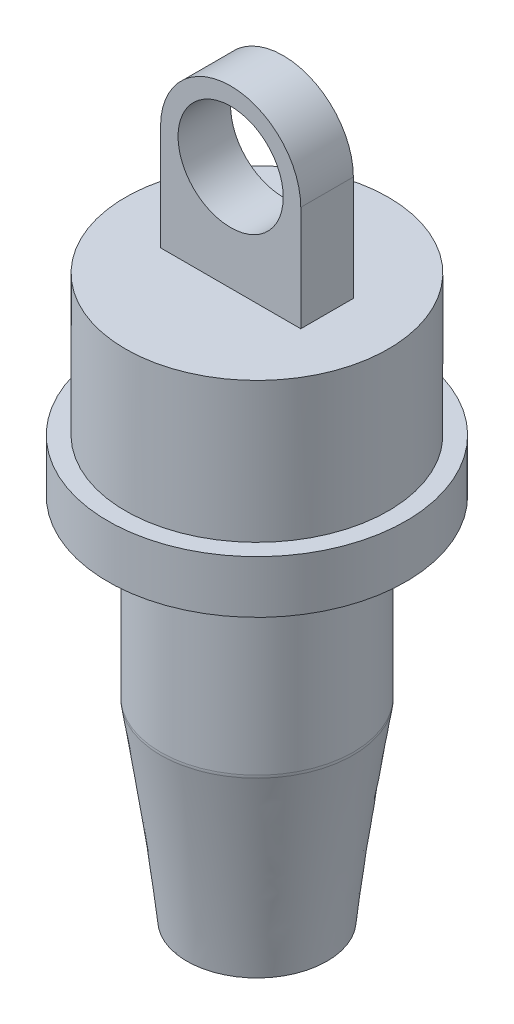
ISO-10303-21;
HEADER;
FILE_DESCRIPTION(('STEP AP214'),'2;1');
FILE_NAME('part.step','',(''),(''),'','','');
FILE_SCHEMA(('AUTOMOTIVE_DESIGN { 1 0 10303 214 1 1 1 1 }'));
ENDSEC;
DATA;
#1=APPLICATION_CONTEXT('core data for automotive mechanical design processes');
#2=APPLICATION_PROTOCOL_DEFINITION('international standard','automotive_design',2000,#1);
#3=PRODUCT_CONTEXT('',#1,'mechanical');
#4=PRODUCT('Part','Part','',(#3));
#5=PRODUCT_RELATED_PRODUCT_CATEGORY('part','',(#4));
#6=PRODUCT_DEFINITION_FORMATION('','',#4);
#7=PRODUCT_DEFINITION_CONTEXT('part definition',#1,'design');
#8=PRODUCT_DEFINITION('design','',#6,#7);
#9=PRODUCT_DEFINITION_SHAPE('','',#8);
#10=(LENGTH_UNIT() NAMED_UNIT(*) SI_UNIT(.MILLI.,.METRE.));
#11=(NAMED_UNIT(*) PLANE_ANGLE_UNIT() SI_UNIT($,.RADIAN.));
#12=(NAMED_UNIT(*) SI_UNIT($,.STERADIAN.) SOLID_ANGLE_UNIT());
#13=UNCERTAINTY_MEASURE_WITH_UNIT(LENGTH_MEASURE(1.E-05),#10,'distance_accuracy_value','');
#14=(GEOMETRIC_REPRESENTATION_CONTEXT(3) GLOBAL_UNCERTAINTY_ASSIGNED_CONTEXT((#13)) GLOBAL_UNIT_ASSIGNED_CONTEXT((#10,
#11,#12)) REPRESENTATION_CONTEXT('',''));
#15=CARTESIAN_POINT('',(0.,0.,0.));
#16=DIRECTION('',(0.,0.,1.));
#17=DIRECTION('',(1.,0.,0.));
#18=AXIS2_PLACEMENT_3D('',#15,#16,#17);
#19=CARTESIAN_POINT('',(0.,-3.,0.));
#20=DIRECTION('',(0.,-1.,0.));
#21=DIRECTION('',(0.,0.,-1.));
#22=AXIS2_PLACEMENT_3D('',#19,#20,#21);
#23=PLANE('',#22);
#24=CARTESIAN_POINT('',(0.,-3.,0.));
#25=DIRECTION('',(0.,-1.,0.));
#26=DIRECTION('',(0.,0.,-1.));
#27=AXIS2_PLACEMENT_3D('',#24,#25,#26);
#28=CIRCLE('',#27,8.5);
#29=CARTESIAN_POINT('',(0.,-3.,-8.5));
#30=VERTEX_POINT('',#29);
#31=EDGE_CURVE('E115',#30,#30,#28,.T.);
#32=ORIENTED_EDGE('',*,*,#31,.T.);
#33=EDGE_LOOP('',(#32));
#34=FACE_BOUND('',#33,.T.);
#35=CARTESIAN_POINT('',(0.,-3.,0.));
#36=DIRECTION('',(0.,-1.,0.));
#37=DIRECTION('',(0.,0.,-1.));
#38=AXIS2_PLACEMENT_3D('',#35,#36,#37);
#39=CIRCLE('',#38,5.5);
#40=CARTESIAN_POINT('',(0.,-3.,-5.5));
#41=VERTEX_POINT('',#40);
#42=EDGE_CURVE('E191',#41,#41,#39,.T.);
#43=ORIENTED_EDGE('',*,*,#42,.F.);
#44=EDGE_LOOP('',(#43));
#45=FACE_BOUND('',#44,.T.);
#46=ADVANCED_FACE('F38',(#34,#45),#23,.T.);
#47=CARTESIAN_POINT('',(4.,18.,1.5));
#48=DIRECTION('',(-1.,0.,0.));
#49=DIRECTION('',(0.,0.,1.));
#50=AXIS2_PLACEMENT_3D('',#47,#48,#49);
#51=PLANE('',#50);
#52=DIRECTION('',(0.,0.,-1.));
#53=VECTOR('',#52,1.);
#54=CARTESIAN_POINT('',(4.,14.,48.9022242487809));
#55=LINE('',#54,#53);
#56=CARTESIAN_POINT('',(4.,14.,1.5));
#57=VERTEX_POINT('',#56);
#58=CARTESIAN_POINT('',(4.,14.,-1.5));
#59=VERTEX_POINT('',#58);
#60=EDGE_CURVE('E91',#57,#59,#55,.T.);
#61=ORIENTED_EDGE('',*,*,#60,.F.);
#62=DIRECTION('',(0.,-1.,0.));
#63=VECTOR('',#62,1.);
#64=CARTESIAN_POINT('',(4.,18.,1.5));
#65=LINE('',#64,#63);
#66=CARTESIAN_POINT('',(4.,8.,1.5));
#67=VERTEX_POINT('',#66);
#68=EDGE_CURVE('E78',#57,#67,#65,.T.);
#69=ORIENTED_EDGE('',*,*,#68,.T.);
#70=DIRECTION('',(0.,0.,-1.));
#71=VECTOR('',#70,1.);
#72=CARTESIAN_POINT('',(4.,8.,1.5));
#73=LINE('',#72,#71);
#74=CARTESIAN_POINT('',(4.,8.,-1.5));
#75=VERTEX_POINT('',#74);
#76=EDGE_CURVE('E98',#67,#75,#73,.T.);
#77=ORIENTED_EDGE('',*,*,#76,.T.);
#78=DIRECTION('',(0.,-1.,0.));
#79=VECTOR('',#78,1.);
#80=CARTESIAN_POINT('',(4.,18.,-1.5));
#81=LINE('',#80,#79);
#82=EDGE_CURVE('E93',#59,#75,#81,.T.);
#83=ORIENTED_EDGE('',*,*,#82,.F.);
#84=EDGE_LOOP('',(#61,#69,#77,#83));
#85=FACE_BOUND('',#84,.T.);
#86=ADVANCED_FACE('F92',(#85),#51,.F.);
#87=CARTESIAN_POINT('',(-4.,18.,-1.5));
#88=DIRECTION('',(0.,0.,1.));
#89=DIRECTION('',(1.,0.,0.));
#90=AXIS2_PLACEMENT_3D('',#87,#88,#89);
#91=PLANE('',#90);
#92=CARTESIAN_POINT('',(0.,14.,-1.5));
#93=DIRECTION('',(0.,0.,1.));
#94=DIRECTION('',(1.,0.,0.));
#95=AXIS2_PLACEMENT_3D('',#92,#93,#94);
#96=CIRCLE('',#95,3.);
#97=CARTESIAN_POINT('',(3.,14.,-1.5));
#98=VERTEX_POINT('',#97);
#99=EDGE_CURVE('E184',#98,#98,#96,.F.);
#100=ORIENTED_EDGE('',*,*,#99,.F.);
#101=EDGE_LOOP('',(#100));
#102=FACE_BOUND('',#101,.T.);
#103=CARTESIAN_POINT('',(0.,14.,-1.5));
#104=DIRECTION('',(0.,0.,1.));
#105=DIRECTION('',(1.,0.,0.));
#106=AXIS2_PLACEMENT_3D('',#103,#104,#105);
#107=CIRCLE('',#106,4.);
#108=CARTESIAN_POINT('',(-4.,14.,-1.5));
#109=VERTEX_POINT('',#108);
#110=EDGE_CURVE('E53',#59,#109,#107,.T.);
#111=ORIENTED_EDGE('',*,*,#110,.F.);
#112=ORIENTED_EDGE('',*,*,#82,.T.);
#113=DIRECTION('',(-1.,0.,0.));
#114=VECTOR('',#113,1.);
#115=CARTESIAN_POINT('',(-4.,8.,-1.5));
#116=LINE('',#115,#114);
#117=CARTESIAN_POINT('',(-4.,8.,-1.5));
#118=VERTEX_POINT('',#117);
#119=EDGE_CURVE('E103',#75,#118,#116,.T.);
#120=ORIENTED_EDGE('',*,*,#119,.T.);
#121=DIRECTION('',(0.,-1.,0.));
#122=VECTOR('',#121,1.);
#123=CARTESIAN_POINT('',(-4.,18.,-1.5));
#124=LINE('',#123,#122);
#125=EDGE_CURVE('E111',#109,#118,#124,.T.);
#126=ORIENTED_EDGE('',*,*,#125,.F.);
#127=EDGE_LOOP('',(#111,#112,#120,#126));
#128=FACE_BOUND('',#127,.T.);
#129=ADVANCED_FACE('F154',(#102,#128),#91,.F.);
#130=CARTESIAN_POINT('',(-4.,18.,1.5));
#131=DIRECTION('',(0.,0.,-1.));
#132=DIRECTION('',(-1.,0.,0.));
#133=AXIS2_PLACEMENT_3D('',#130,#131,#132);
#134=PLANE('',#133);
#135=CARTESIAN_POINT('',(0.,14.,1.5));
#136=DIRECTION('',(0.,0.,1.));
#137=DIRECTION('',(1.,0.,0.));
#138=AXIS2_PLACEMENT_3D('',#135,#136,#137);
#139=CIRCLE('',#138,3.);
#140=CARTESIAN_POINT('',(3.,14.,1.5));
#141=VERTEX_POINT('',#140);
#142=EDGE_CURVE('E186',#141,#141,#139,.T.);
#143=ORIENTED_EDGE('',*,*,#142,.F.);
#144=EDGE_LOOP('',(#143));
#145=FACE_BOUND('',#144,.T.);
#146=CARTESIAN_POINT('',(0.,14.,1.5));
#147=DIRECTION('',(0.,0.,-1.));
#148=DIRECTION('',(-1.,0.,0.));
#149=AXIS2_PLACEMENT_3D('',#146,#147,#148);
#150=CIRCLE('',#149,4.);
#151=CARTESIAN_POINT('',(-4.,14.,1.5));
#152=VERTEX_POINT('',#151);
#153=EDGE_CURVE('E82',#152,#57,#150,.T.);
#154=ORIENTED_EDGE('',*,*,#153,.F.);
#155=DIRECTION('',(0.,-1.,0.));
#156=VECTOR('',#155,1.);
#157=CARTESIAN_POINT('',(-4.,18.,1.5));
#158=LINE('',#157,#156);
#159=CARTESIAN_POINT('',(-4.,8.,1.5));
#160=VERTEX_POINT('',#159);
#161=EDGE_CURVE('E89',#152,#160,#158,.T.);
#162=ORIENTED_EDGE('',*,*,#161,.T.);
#163=DIRECTION('',(1.,0.,0.));
#164=VECTOR('',#163,1.);
#165=CARTESIAN_POINT('',(-4.,8.,1.5));
#166=LINE('',#165,#164);
#167=EDGE_CURVE('E85',#160,#67,#166,.T.);
#168=ORIENTED_EDGE('',*,*,#167,.T.);
#169=ORIENTED_EDGE('',*,*,#68,.F.);
#170=EDGE_LOOP('',(#154,#162,#168,#169));
#171=FACE_BOUND('',#170,.T.);
#172=ADVANCED_FACE('F80',(#145,#171),#134,.F.);
#173=CARTESIAN_POINT('',(0.,8.,0.));
#174=DIRECTION('',(0.,1.,0.));
#175=DIRECTION('',(0.,0.,1.));
#176=AXIS2_PLACEMENT_3D('',#173,#174,#175);
#177=PLANE('',#176);
#178=CARTESIAN_POINT('',(0.,8.,0.));
#179=DIRECTION('',(0.,1.,0.));
#180=DIRECTION('',(0.,0.,1.));
#181=AXIS2_PLACEMENT_3D('',#178,#179,#180);
#182=CIRCLE('',#181,7.5);
#183=CARTESIAN_POINT('',(0.,8.,7.5));
#184=VERTEX_POINT('',#183);
#185=EDGE_CURVE('E123',#184,#184,#182,.T.);
#186=ORIENTED_EDGE('',*,*,#185,.T.);
#187=EDGE_LOOP('',(#186));
#188=FACE_BOUND('',#187,.T.);
#189=ORIENTED_EDGE('',*,*,#119,.F.);
#190=ORIENTED_EDGE('',*,*,#76,.F.);
#191=ORIENTED_EDGE('',*,*,#167,.F.);
#192=DIRECTION('',(0.,0.,1.));
#193=VECTOR('',#192,1.);
#194=CARTESIAN_POINT('',(-4.,8.,1.5));
#195=LINE('',#194,#193);
#196=EDGE_CURVE('E106',#118,#160,#195,.T.);
#197=ORIENTED_EDGE('',*,*,#196,.F.);
#198=EDGE_LOOP('',(#189,#190,#191,#197));
#199=FACE_BOUND('',#198,.T.);
#200=ADVANCED_FACE('F169',(#188,#199),#177,.T.);
#201=CARTESIAN_POINT('',(0.,8.,0.));
#202=DIRECTION('',(0.,-1.,0.));
#203=DIRECTION('',(0.,0.,-1.));
#204=AXIS2_PLACEMENT_3D('',#201,#202,#203);
#205=CYLINDRICAL_SURFACE('',#204,7.5);
#206=ORIENTED_EDGE('',*,*,#185,.F.);
#207=EDGE_LOOP('',(#206));
#208=FACE_BOUND('',#207,.T.);
#209=CARTESIAN_POINT('',(0.,0.,0.));
#210=DIRECTION('',(0.,-1.,0.));
#211=DIRECTION('',(0.,0.,-1.));
#212=AXIS2_PLACEMENT_3D('',#209,#210,#211);
#213=CIRCLE('',#212,7.5);
#214=CARTESIAN_POINT('',(0.,0.,-7.5));
#215=VERTEX_POINT('',#214);
#216=EDGE_CURVE('E118',#215,#215,#213,.T.);
#217=ORIENTED_EDGE('',*,*,#216,.F.);
#218=EDGE_LOOP('',(#217));
#219=FACE_BOUND('',#218,.T.);
#220=ADVANCED_FACE('F163',(#208,#219),#205,.T.);
#221=CARTESIAN_POINT('',(0.,0.,0.));
#222=DIRECTION('',(0.,-1.,0.));
#223=DIRECTION('',(0.,0.,-1.));
#224=AXIS2_PLACEMENT_3D('',#221,#222,#223);
#225=PLANE('',#224);
#226=CARTESIAN_POINT('',(0.,0.,0.));
#227=DIRECTION('',(0.,-1.,0.));
#228=DIRECTION('',(0.,0.,-1.));
#229=AXIS2_PLACEMENT_3D('',#226,#227,#228);
#230=CIRCLE('',#229,8.5);
#231=CARTESIAN_POINT('',(0.,0.,-8.5));
#232=VERTEX_POINT('',#231);
#233=EDGE_CURVE('E114',#232,#232,#230,.T.);
#234=ORIENTED_EDGE('',*,*,#233,.F.);
#235=EDGE_LOOP('',(#234));
#236=FACE_BOUND('',#235,.T.);
#237=ORIENTED_EDGE('',*,*,#216,.T.);
#238=EDGE_LOOP('',(#237));
#239=FACE_BOUND('',#238,.T.);
#240=ADVANCED_FACE('F159',(#236,#239),#225,.F.);
#241=CARTESIAN_POINT('',(0.,-3.,0.));
#242=DIRECTION('',(0.,1.,0.));
#243=DIRECTION('',(0.,0.,1.));
#244=AXIS2_PLACEMENT_3D('',#241,#242,#243);
#245=CYLINDRICAL_SURFACE('',#244,8.5);
#246=ORIENTED_EDGE('',*,*,#31,.F.);
#247=EDGE_LOOP('',(#246));
#248=FACE_BOUND('',#247,.T.);
#249=ORIENTED_EDGE('',*,*,#233,.T.);
#250=EDGE_LOOP('',(#249));
#251=FACE_BOUND('',#250,.T.);
#252=ADVANCED_FACE('F162',(#248,#251),#245,.T.);
#253=CARTESIAN_POINT('',(-4.,18.,1.5));
#254=DIRECTION('',(1.,0.,0.));
#255=DIRECTION('',(0.,0.,-1.));
#256=AXIS2_PLACEMENT_3D('',#253,#254,#255);
#257=PLANE('',#256);
#258=ORIENTED_EDGE('',*,*,#161,.F.);
#259=DIRECTION('',(0.,0.,-1.));
#260=VECTOR('',#259,1.);
#261=CARTESIAN_POINT('',(-4.,13.999999870631,48.9022242487809));
#262=LINE('',#261,#260);
#263=EDGE_CURVE('E94',#152,#109,#262,.T.);
#264=ORIENTED_EDGE('',*,*,#263,.T.);
#265=ORIENTED_EDGE('',*,*,#125,.T.);
#266=ORIENTED_EDGE('',*,*,#196,.T.);
#267=EDGE_LOOP('',(#258,#264,#265,#266));
#268=FACE_BOUND('',#267,.T.);
#269=ADVANCED_FACE('F167',(#268),#257,.F.);
#270=CARTESIAN_POINT('',(0.,14.,48.9022242487809));
#271=DIRECTION('',(0.,0.,-1.));
#272=DIRECTION('',(-1.,0.,0.));
#273=AXIS2_PLACEMENT_3D('',#270,#271,#272);
#274=CYLINDRICAL_SURFACE('',#273,4.);
#275=ORIENTED_EDGE('',*,*,#60,.T.);
#276=ORIENTED_EDGE('',*,*,#110,.T.);
#277=ORIENTED_EDGE('',*,*,#263,.F.);
#278=ORIENTED_EDGE('',*,*,#153,.T.);
#279=EDGE_LOOP('',(#275,#276,#277,#278));
#280=FACE_BOUND('',#279,.T.);
#281=ADVANCED_FACE('F96',(#280),#274,.T.);
#282=CARTESIAN_POINT('',(0.,14.,-9.98528137423857));
#283=DIRECTION('',(0.,0.,1.));
#284=DIRECTION('',(1.,0.,0.));
#285=AXIS2_PLACEMENT_3D('',#282,#283,#284);
#286=CYLINDRICAL_SURFACE('',#285,3.);
#287=ORIENTED_EDGE('',*,*,#99,.T.);
#288=EDGE_LOOP('',(#287));
#289=FACE_BOUND('',#288,.T.);
#290=ORIENTED_EDGE('',*,*,#142,.T.);
#291=EDGE_LOOP('',(#290));
#292=FACE_BOUND('',#291,.T.);
#293=ADVANCED_FACE('F274',(#289,#292),#286,.F.);
#294=CARTESIAN_POINT('',(0.,-13.,0.));
#295=DIRECTION('',(0.,1.,0.));
#296=DIRECTION('',(0.,0.,1.));
#297=AXIS2_PLACEMENT_3D('',#294,#295,#296);
#298=CYLINDRICAL_SURFACE('',#297,5.5);
#299=CARTESIAN_POINT('',(0.,-12.9207997010204,0.));
#300=DIRECTION('',(0.,1.,0.));
#301=DIRECTION('',(0.,0.,1.));
#302=AXIS2_PLACEMENT_3D('',#299,#300,#301);
#303=CIRCLE('',#302,5.5);
#304=CARTESIAN_POINT('',(0.,-12.9207997010204,5.5));
#305=VERTEX_POINT('',#304);
#306=EDGE_CURVE('E12',#305,#305,#303,.T.);
#307=ORIENTED_EDGE('',*,*,#306,.T.);
#308=EDGE_LOOP('',(#307));
#309=FACE_BOUND('',#308,.T.);
#310=ORIENTED_EDGE('',*,*,#42,.T.);
#311=EDGE_LOOP('',(#310));
#312=FACE_BOUND('',#311,.T.);
#313=ADVANCED_FACE('F143',(#309,#312),#298,.T.);
#314=CARTESIAN_POINT('',(0.,-24.,0.));
#315=DIRECTION('',(0.,-1.,0.));
#316=DIRECTION('',(0.,0.,-1.));
#317=AXIS2_PLACEMENT_3D('',#314,#315,#316);
#318=PLANE('',#317);
#319=CARTESIAN_POINT('',(0.,-24.,0.));
#320=DIRECTION('',(0.,-1.,0.));
#321=DIRECTION('',(0.,0.,-1.));
#322=AXIS2_PLACEMENT_3D('',#319,#320,#321);
#323=CIRCLE('',#322,1.75);
#324=CARTESIAN_POINT('',(0.,-24.,-1.75));
#325=VERTEX_POINT('',#324);
#326=EDGE_CURVE('E233',#325,#325,#323,.T.);
#327=ORIENTED_EDGE('',*,*,#326,.F.);
#328=EDGE_LOOP('',(#327));
#329=FACE_BOUND('',#328,.T.);
#330=CARTESIAN_POINT('',(0.,-24.,0.));
#331=DIRECTION('',(0.,-1.,0.));
#332=DIRECTION('',(0.,0.,-1.));
#333=AXIS2_PLACEMENT_3D('',#330,#331,#332);
#334=CIRCLE('',#333,4.);
#335=CARTESIAN_POINT('',(-0.660465844731431,-24.,3.94509630654857));
#336=VERTEX_POINT('',#335);
#337=EDGE_CURVE('E196',#336,#336,#334,.T.);
#338=ORIENTED_EDGE('',*,*,#337,.T.);
#339=EDGE_LOOP('',(#338));
#340=FACE_BOUND('',#339,.T.);
#341=ADVANCED_FACE('F134',(#329,#340),#318,.T.);
#342=CARTESIAN_POINT('',(1.05434897283438,-13.,5.39799483544428));
#343=CARTESIAN_POINT('',(-0.660465844731431,-24.,3.94509630654857));
#344=CARTESIAN_POINT('',(-9.74164069805419,-13.,7.50669278111303));
#345=CARTESIAN_POINT('',(-8.55065845782857,-24.,2.62416461708571));
#346=CARTESIAN_POINT('',(-11.8503386437229,-13.,-3.28929688977553));
#347=CARTESIAN_POINT('',(-7.22972676836571,-24.,-5.26602799601143));
#348=CARTESIAN_POINT('',(-1.05434897283437,-13.,-5.39799483544428));
#349=CARTESIAN_POINT('',(0.660465844731429,-24.,-3.94509630654857));
#350=CARTESIAN_POINT('',(9.74164069805418,-13.,-7.50669278111302));
#351=CARTESIAN_POINT('',(8.55065845782858,-24.,-2.62416461708572));
#352=CARTESIAN_POINT('',(11.8503386437229,-13.,3.28929688977554));
#353=CARTESIAN_POINT('',(7.22972676836572,-24.,5.26602799601143));
#354=CARTESIAN_POINT('',(1.05434897283438,-13.,5.39799483544428));
#355=CARTESIAN_POINT('',(-0.660465844731431,-24.,3.94509630654857));
#356=(BOUNDED_SURFACE() B_SPLINE_SURFACE(3,1,((#342,#343),(#344,#345),(#346,#347),(#348,#349),
(#350,#351),(#352,#353),(#354,#355)),.UNSPECIFIED.,.T.,.F.,.F.) B_SPLINE_SURFACE_WITH_KNOTS((4,
3,4),(2,2),(0.,0.5,1.),(0.,1.),
.UNSPECIFIED.) GEOMETRIC_REPRESENTATION_ITEM() RATIONAL_B_SPLINE_SURFACE(((1.,1.),
(0.333333333333333,0.333333333333334),(0.333333333333333,0.333333333333334),(1.,1.),
(0.333333333333333,0.333333333333333),(0.333333333333333,0.333333333333333),(1.,1.))) REPRESENTATION_ITEM('') SURFACE());
#357=CARTESIAN_POINT('',(0.,-13.0781009925885,0.));
#358=DIRECTION('',(0.,-1.,0.));
#359=DIRECTION('',(0.,0.,-1.));
#360=AXIS2_PLACEMENT_3D('',#357,#358,#359);
#361=CIRCLE('',#360,5.48755065878719);
#362=CARTESIAN_POINT('',(1.0421736328928,-13.0781009925885,5.38767912478636));
#363=VERTEX_POINT('',#362);
#364=EDGE_CURVE('E46',#363,#363,#361,.T.);
#365=CARTESIAN_POINT('',(1.0421736328928,-13.0781009925885,5.38767912478636));
#366=CARTESIAN_POINT('',(1.02443780500088,-13.1918707739157,5.37265222042972));
#367=CARTESIAN_POINT('',(1.00670197710896,-13.3056405552429,5.35762531607307));
#368=CARTESIAN_POINT('',(0.971230321325126,-13.5331801178973,5.32757150735979));
#369=CARTESIAN_POINT('',(0.953494493433207,-13.6469498992245,5.31254460300314));
#370=CARTESIAN_POINT('',(0.918022837649369,-13.8744894618789,5.28249079428986));
#371=CARTESIAN_POINT('',(0.90028700975745,-13.9882592432061,5.26746388993321));
#372=CARTESIAN_POINT('',(0.864815353973612,-14.2157988058605,5.23741008121992));
#373=CARTESIAN_POINT('',(0.847079526081693,-14.3295685871877,5.22238317686328));
#374=CARTESIAN_POINT('',(0.811607870297855,-14.5571081498421,5.19232936814999));
#375=CARTESIAN_POINT('',(0.793872042405936,-14.6708779311693,5.17730246379335));
#376=CARTESIAN_POINT('',(0.758400386622097,-14.8984174938237,5.14724865508006));
#377=CARTESIAN_POINT('',(0.740664558730178,-15.0121872751509,5.13222175072342));
#378=CARTESIAN_POINT('',(0.70519290294634,-15.2397268378053,5.10216794201013));
#379=CARTESIAN_POINT('',(0.687457075054421,-15.3534966191325,5.08714103765349));
#380=CARTESIAN_POINT('',(0.651985419270583,-15.5810361817869,5.0570872289402));
#381=CARTESIAN_POINT('',(0.634249591378664,-15.6948059631142,5.04206032458356));
#382=CARTESIAN_POINT('',(0.598777935594825,-15.9223455257686,5.01200651587027));
#383=CARTESIAN_POINT('',(0.581042107702906,-16.0361153070958,4.99697961151363));
#384=CARTESIAN_POINT('',(0.545570451919068,-16.2636548697502,4.96692580280034));
#385=CARTESIAN_POINT('',(0.527834624027149,-16.3774246510774,4.9518988984437));
#386=CARTESIAN_POINT('',(0.492362968243311,-16.6049642137318,4.92184508973041));
#387=CARTESIAN_POINT('',(0.474627140351392,-16.718733995059,4.90681818537377));
#388=CARTESIAN_POINT('',(0.439155484567554,-16.9462735577134,4.87676437666048));
#389=CARTESIAN_POINT('',(0.421419656675634,-17.0600433390406,4.86173747230383));
#390=CARTESIAN_POINT('',(0.385948000891796,-17.287582901695,4.83168366359055));
#391=CARTESIAN_POINT('',(0.368212172999877,-17.4013526830222,4.8166567592339));
#392=CARTESIAN_POINT('',(0.332740517216039,-17.6288922456766,4.78660295052062));
#393=CARTESIAN_POINT('',(0.31500468932412,-17.7426620270038,4.77157604616397));
#394=CARTESIAN_POINT('',(0.279533033540282,-17.9702015896582,4.74152223745068));
#395=CARTESIAN_POINT('',(0.261797205648363,-18.0839713709854,4.72649533309404));
#396=CARTESIAN_POINT('',(0.226325549864524,-18.3115109336398,4.69644152438075));
#397=CARTESIAN_POINT('',(0.208589721972605,-18.425280714967,4.68141462002411));
#398=CARTESIAN_POINT('',(0.173118066188767,-18.6528202776214,4.65136081131082));
#399=CARTESIAN_POINT('',(0.155382238296848,-18.7665900589486,4.63633390695418));
#400=CARTESIAN_POINT('',(0.11991058251301,-18.9941296216031,4.60628009824089));
#401=CARTESIAN_POINT('',(0.102174754621091,-19.1078994029303,4.59125319388425));
#402=CARTESIAN_POINT('',(0.0667030988372525,-19.3354389655847,4.56119938517096));
#403=CARTESIAN_POINT('',(0.0489672709453333,-19.4492087469119,4.54617248081432));
#404=CARTESIAN_POINT('',(0.013495615161495,-19.6767483095663,4.51611867210103));
#405=CARTESIAN_POINT('',(-0.00424021273042414,-19.7905180908935,4.50109176774439));
#406=CARTESIAN_POINT('',(-0.0397118685142622,-20.0180576535479,4.4710379590311));
#407=CARTESIAN_POINT('',(-0.0574476964061812,-20.1318274348751,4.45601105467446));
#408=CARTESIAN_POINT('',(-0.0929193521900195,-20.3593669975295,4.42595724596117));
#409=CARTESIAN_POINT('',(-0.110655180081939,-20.4731367788567,4.41093034160453));
#410=CARTESIAN_POINT('',(-0.146126835865777,-20.7006763415111,4.38087653289124));
#411=CARTESIAN_POINT('',(-0.163862663757696,-20.8144461228383,4.36584962853459));
#412=CARTESIAN_POINT('',(-0.199334319541534,-21.0419856854927,4.33579581982131));
#413=CARTESIAN_POINT('',(-0.217070147433453,-21.1557554668199,4.32076891546466));
#414=CARTESIAN_POINT('',(-0.252541803217291,-21.3832950294743,4.29071510675138));
#415=CARTESIAN_POINT('',(-0.27027763110921,-21.4970648108015,4.27568820239473));
#416=CARTESIAN_POINT('',(-0.305749286893048,-21.7246043734559,4.24563439368145));
#417=CARTESIAN_POINT('',(-0.323485114784967,-21.8383741547831,4.2306074893248));
#418=CARTESIAN_POINT('',(-0.358956770568806,-22.0659137174375,4.20055368061151));
#419=CARTESIAN_POINT('',(-0.376692598460725,-22.1796834987647,4.18552677625487));
#420=CARTESIAN_POINT('',(-0.412164254244563,-22.4072230614192,4.15547296754158));
#421=CARTESIAN_POINT('',(-0.429900082136482,-22.5209928427464,4.14044606318494));
#422=CARTESIAN_POINT('',(-0.46537173792032,-22.7485324054008,4.11039225447165));
#423=CARTESIAN_POINT('',(-0.48310756581224,-22.862302186728,4.09536535011501));
#424=CARTESIAN_POINT('',(-0.518579221596078,-23.0898417493824,4.06531154140172));
#425=CARTESIAN_POINT('',(-0.536315049487997,-23.2036115307096,4.05028463704508));
#426=CARTESIAN_POINT('',(-0.571786705271835,-23.431151093364,4.02023082833179));
#427=CARTESIAN_POINT('',(-0.589522533163754,-23.5449208746912,4.00520392397515));
#428=CARTESIAN_POINT('',(-0.624994188947593,-23.7724604373456,3.97515011526186));
#429=CARTESIAN_POINT('',(-0.642730016839512,-23.8862302186728,3.96012321090522));
#430=CARTESIAN_POINT('',(-0.660465844731431,-24.,3.94509630654857));
#431=B_SPLINE_CURVE_WITH_KNOTS('',3,(#365,#366,#367,#368,#369,#370,#371,#372,#373,#374,#375,
#376,#377,#378,#379,#380,#381,#382,#383,#384,#385,#386,#387,#388,#389,#390,#391,#392,#393,#394,
#395,#396,#397,#398,#399,#400,#401,#402,#403,#404,#405,#406,#407,#408,#409,#410,#411,#412,#413,
#414,#415,#416,#417,#418,#419,#420,#421,#422,#423,#424,#425,#426,#427,#428,#429,#430),
.UNSPECIFIED.,.F.,.F.,(4,2,2,2,2,2,2,2,2,2,2,2,2,2,2,2,2,2,2,2,2,2,2,2,2,2,2,2,2,2,2,2,4),(0.,
0.348360984180428,0.696721968360857,1.04508295254128,1.39344393672171,1.74180492090214,
2.09016590508257,2.438526889263,2.78688787344342,3.13524885762385,3.48360984180428,
3.83197082598471,4.18033181016514,4.52869279434557,4.877053778526,5.22541476270642,
5.57377574688685,5.92213673106728,6.27049771524771,6.61885869942813,6.96721968360856,
7.31558066778899,7.66394165196942,8.01230263614985,8.36066362033027,8.7090246045107,
9.05738558869113,9.40574657287156,9.75410755705199,10.1024685412324,10.4508295254128,
10.7991905095933,11.1475514937737),.UNSPECIFIED.);
#432=EDGE_CURVE('BSEAM128',#363,#336,#431,.T.);
#433=ORIENTED_EDGE('',*,*,#364,.T.);
#434=ORIENTED_EDGE('',*,*,#337,.F.);
#435=ORIENTED_EDGE('',*,*,#432,.T.);
#436=ORIENTED_EDGE('',*,*,#432,.F.);
#437=EDGE_LOOP('',(#433,#435,#434,#436));
#438=FACE_BOUND('',#437,.T.);
#439=ADVANCED_FACE('F128',(#438),#356,.T.);
#440=CARTESIAN_POINT('',(0.,-12.9207997010204,0.));
#441=DIRECTION('',(0.,1.,0.));
#442=DIRECTION('',(0.,0.,1.));
#443=AXIS2_PLACEMENT_3D('',#440,#441,#442);
#444=TOROIDAL_SURFACE('',#443,4.5,1.);
#445=ORIENTED_EDGE('',*,*,#306,.F.);
#446=EDGE_LOOP('',(#445));
#447=FACE_BOUND('',#446,.T.);
#448=ORIENTED_EDGE('',*,*,#364,.F.);
#449=EDGE_LOOP('',(#448));
#450=FACE_BOUND('',#449,.T.);
#451=ADVANCED_FACE('F40',(#447,#450),#444,.T.);
#452=CARTESIAN_POINT('',(0.,-14.,0.));
#453=DIRECTION('',(0.,-1.,0.));
#454=DIRECTION('',(0.,0.,-1.));
#455=AXIS2_PLACEMENT_3D('',#452,#453,#454);
#456=CYLINDRICAL_SURFACE('',#455,1.75);
#457=CARTESIAN_POINT('',(0.,-14.,0.));
#458=DIRECTION('',(0.,-1.,0.));
#459=DIRECTION('',(0.,0.,-1.));
#460=AXIS2_PLACEMENT_3D('',#457,#458,#459);
#461=CIRCLE('',#460,1.75);
#462=CARTESIAN_POINT('',(0.,-14.,-1.75));
#463=VERTEX_POINT('',#462);
#464=EDGE_CURVE('E201',#463,#463,#461,.T.);
#465=ORIENTED_EDGE('',*,*,#464,.F.);
#466=EDGE_LOOP('',(#465));
#467=FACE_BOUND('',#466,.T.);
#468=ORIENTED_EDGE('',*,*,#326,.T.);
#469=EDGE_LOOP('',(#468));
#470=FACE_BOUND('',#469,.T.);
#471=ADVANCED_FACE('F132',(#467,#470),#456,.F.);
#472=CARTESIAN_POINT('',(0.,-14.,0.));
#473=DIRECTION('',(0.,-1.,0.));
#474=DIRECTION('',(0.,0.,-1.));
#475=AXIS2_PLACEMENT_3D('',#472,#473,#474);
#476=PLANE('',#475);
#477=ORIENTED_EDGE('',*,*,#464,.T.);
#478=EDGE_LOOP('',(#477));
#479=FACE_BOUND('',#478,.T.);
#480=ADVANCED_FACE('F139',(#479),#476,.T.);
#481=CLOSED_SHELL('',(#46,#86,#129,#172,#200,#220,#240,#252,#269,#281,#293,#313,#341,#439,#451,
#471,#480));
#482=MANIFOLD_SOLID_BREP('B2',#481);
#483=ADVANCED_BREP_SHAPE_REPRESENTATION('',(#18,#482),#14);
#484=SHAPE_DEFINITION_REPRESENTATION(#9,#483);
ENDSEC;
END-ISO-10303-21;
